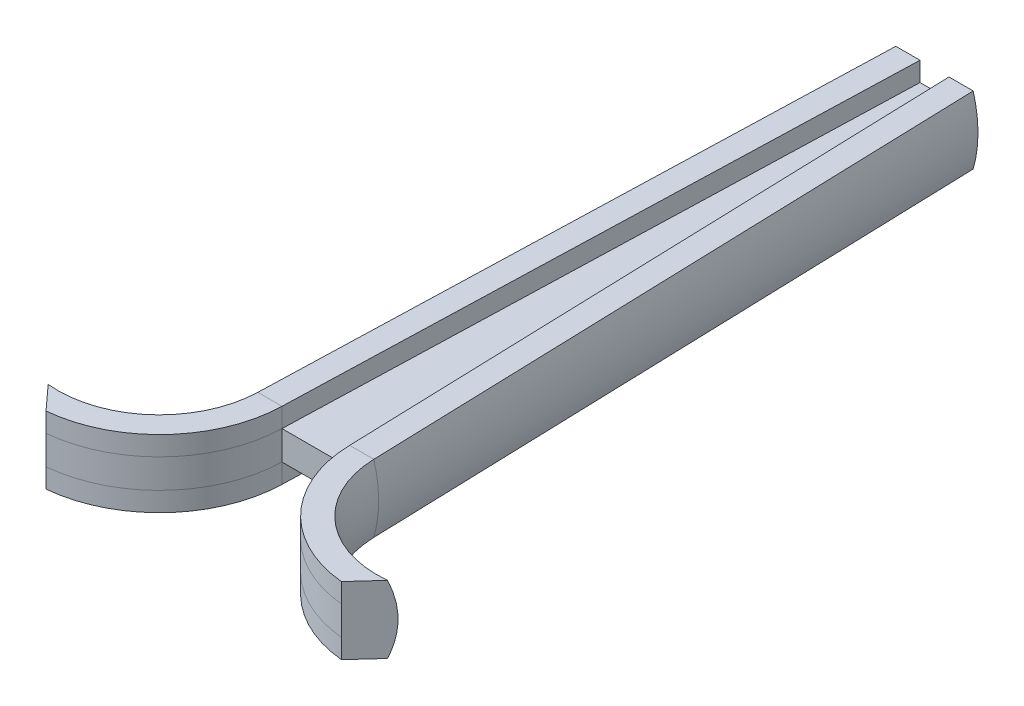
ISO-10303-21;
HEADER;
FILE_DESCRIPTION(('STEP AP214'),'2;1');
FILE_NAME('part.step','',(''),(''),'','','');
FILE_SCHEMA(('AUTOMOTIVE_DESIGN { 1 0 10303 214 1 1 1 1 }'));
ENDSEC;
DATA;
#1=APPLICATION_CONTEXT('core data for automotive mechanical design processes');
#2=APPLICATION_PROTOCOL_DEFINITION('international standard','automotive_design',2000,#1);
#3=PRODUCT_CONTEXT('',#1,'mechanical');
#4=PRODUCT('Part','Part','',(#3));
#5=PRODUCT_RELATED_PRODUCT_CATEGORY('part','',(#4));
#6=PRODUCT_DEFINITION_FORMATION('','',#4);
#7=PRODUCT_DEFINITION_CONTEXT('part definition',#1,'design');
#8=PRODUCT_DEFINITION('design','',#6,#7);
#9=PRODUCT_DEFINITION_SHAPE('','',#8);
#10=(LENGTH_UNIT() NAMED_UNIT(*) SI_UNIT(.MILLI.,.METRE.));
#11=(NAMED_UNIT(*) PLANE_ANGLE_UNIT() SI_UNIT($,.RADIAN.));
#12=(NAMED_UNIT(*) SI_UNIT($,.STERADIAN.) SOLID_ANGLE_UNIT());
#13=UNCERTAINTY_MEASURE_WITH_UNIT(LENGTH_MEASURE(1.E-05),#10,'distance_accuracy_value','');
#14=(GEOMETRIC_REPRESENTATION_CONTEXT(3) GLOBAL_UNCERTAINTY_ASSIGNED_CONTEXT((#13)) GLOBAL_UNIT_ASSIGNED_CONTEXT((#10,
#11,#12)) REPRESENTATION_CONTEXT('',''));
#15=CARTESIAN_POINT('',(0.,0.,0.));
#16=DIRECTION('',(0.,0.,1.));
#17=DIRECTION('',(1.,0.,0.));
#18=AXIS2_PLACEMENT_3D('',#15,#16,#17);
#19=CARTESIAN_POINT('',(3.17638631396321,0.,161.074653814652));
#20=DIRECTION('',(-0.739692933634489,0.,-0.672944547441469));
#21=DIRECTION('',(-0.672944547441469,0.,0.739692933634489));
#22=AXIS2_PLACEMENT_3D('',#19,#20,#21);
#23=CIRCLE('',#22,25.0000000000001);
#24=CARTESIAN_POINT('',(32.9902415217416,0.,127.375304952446));
#25=DIRECTION('',(0.,1.,0.));
#26=AXIS1_PLACEMENT('',#24,#25);
#27=SURFACE_OF_REVOLUTION('',#23,#26);
#28=CARTESIAN_POINT('',(32.9902415217416,-7.,127.375304952446));
#29=DIRECTION('',(0.,-1.,0.));
#30=DIRECTION('',(0.,0.,1.));
#31=AXIS2_PLACEMENT_3D('',#28,#29,#30);
#32=CIRCLE('',#31,20.9995353054177);
#33=CARTESIAN_POINT('',(35.1061024849226,-7.,148.267973892243));
#34=VERTEX_POINT('',#33);
#35=CARTESIAN_POINT('',(12.,-7.,128.));
#36=VERTEX_POINT('',#35);
#37=EDGE_CURVE('E14',#34,#36,#32,.T.);
#38=ORIENTED_EDGE('',*,*,#37,.T.);
#39=CARTESIAN_POINT('',(-12.0000000000001,0.,128.));
#40=DIRECTION('',(0.,0.,-1.));
#41=DIRECTION('',(-1.,0.,0.));
#42=AXIS2_PLACEMENT_3D('',#39,#40,#41);
#43=CIRCLE('',#42,25.0000000000001);
#44=CARTESIAN_POINT('',(12.,7.,128.));
#45=VERTEX_POINT('',#44);
#46=EDGE_CURVE('E159',#45,#36,#43,.T.);
#47=ORIENTED_EDGE('',*,*,#46,.F.);
#48=CARTESIAN_POINT('',(32.9902415217416,7.,127.375304952446));
#49=DIRECTION('',(0.,-1.,0.));
#50=DIRECTION('',(0.,0.,1.));
#51=AXIS2_PLACEMENT_3D('',#48,#49,#50);
#52=CIRCLE('',#51,20.9995353054177);
#53=CARTESIAN_POINT('',(35.1061024849226,7.,148.267973892243));
#54=VERTEX_POINT('',#53);
#55=EDGE_CURVE('E167',#54,#45,#52,.T.);
#56=ORIENTED_EDGE('',*,*,#55,.F.);
#57=CARTESIAN_POINT('',(35.0626526665789,7.14649101288148,148.315733434569));
#58=CARTESIAN_POINT('',(35.1981066814361,6.69434377829867,148.166843933936));
#59=CARTESIAN_POINT('',(35.3232717519765,6.23511321391761,148.02926392297));
#60=CARTESIAN_POINT('',(35.5503418994767,5.30305012162205,147.779671019388));
#61=CARTESIAN_POINT('',(35.6521962294173,4.83019039439527,147.667713907315));
#62=CARTESIAN_POINT('',(35.8292165024508,3.8741353353947,147.473135252103));
#63=CARTESIAN_POINT('',(35.904423367179,3.39095707009063,147.390468728373));
#64=CARTESIAN_POINT('',(35.9952897359116,2.66055889742659,147.290589457322));
#65=CARTESIAN_POINT('',(36.0219141692305,2.41626529683603,147.261324185372));
#66=CARTESIAN_POINT('',(36.0676175522336,1.92613418039715,147.211087550601));
#67=CARTESIAN_POINT('',(36.0866974301155,1.68029685825398,147.190115167516));
#68=CARTESIAN_POINT('',(36.1166137368573,1.19548603271227,147.15723150603));
#69=CARTESIAN_POINT('',(36.1276954346502,0.956545913933226,147.145050630828));
#70=CARTESIAN_POINT('',(36.142473537774,0.47840937396146,147.128806709253));
#71=CARTESIAN_POINT('',(36.1461773689263,0.23921345316919,147.124735500501));
#72=CARTESIAN_POINT('',(36.1461732054388,-0.35725853889842,147.124740076959));
#73=CARTESIAN_POINT('',(36.1379057478503,-0.714556183025839,147.133827571583));
#74=CARTESIAN_POINT('',(36.1050141210901,-1.42778197160046,147.169981670733));
#75=CARTESIAN_POINT('',(36.0803750017539,-1.78370856496889,147.197064708307));
#76=CARTESIAN_POINT('',(36.0152918835942,-2.49239700529461,147.268603325842));
#77=CARTESIAN_POINT('',(35.9748454907622,-2.84515836459559,147.313061537269));
#78=CARTESIAN_POINT('',(35.8785841954912,-3.54920150774648,147.418870849738));
#79=CARTESIAN_POINT('',(35.822638205367,-3.90044348830422,147.480366040861));
#80=CARTESIAN_POINT('',(35.6966064461704,-4.59719219762049,147.618898706065));
#81=CARTESIAN_POINT('',(35.6265229978706,-4.94269985764991,147.695933629179));
#82=CARTESIAN_POINT('',(35.4733538738764,-5.62723819108236,147.864295374734));
#83=CARTESIAN_POINT('',(35.3902687115773,-5.96626911963751,147.955621632858));
#84=CARTESIAN_POINT('',(35.1855580116418,-6.73782441950619,148.180637287948));
#85=CARTESIAN_POINT('',(35.0598407061075,-7.16795537785026,148.31882430929));
#86=CARTESIAN_POINT('',(34.7905809700665,-8.01586710350925,148.614791525042));
#87=CARTESIAN_POINT('',(34.6470304554189,-8.4336421626296,148.772580605447));
#88=CARTESIAN_POINT('',(34.3440113031595,-9.25659834892592,149.105655784575));
#89=CARTESIAN_POINT('',(34.1845311367843,-9.66177007248051,149.280954555582));
#90=CARTESIAN_POINT('',(33.8545672221664,-10.4513946783871,149.643647108669));
#91=CARTESIAN_POINT('',(33.6843510432102,-10.83609524011,149.830746781655));
#92=CARTESIAN_POINT('',(33.3317238667379,-11.5923985073428,150.218350532418));
#93=CARTESIAN_POINT('',(33.1493241309992,-11.9640128366648,150.418842231379));
#94=CARTESIAN_POINT('',(32.7736688132814,-12.6934345748804,150.831758251064));
#95=CARTESIAN_POINT('',(32.5804419946734,-13.0512746687439,151.04415095542));
#96=CARTESIAN_POINT('',(32.3820729735767,-13.4026338450831,151.262195909815));
#97=B_SPLINE_CURVE_WITH_KNOTS('',3,(#57,#58,#59,#60,#61,#62,#63,#64,#65,#66,#67,#68,#69,#70,#71,
#72,#73,#74,#75,#76,#77,#78,#79,#80,#81,#82,#83,#84,#85,#86,#87,#88,#89,#90,#91,#92,#93,#94,#95,
#96),.UNSPECIFIED.,.F.,.F.,(4,2,2,2,2,2,2,2,2,2,2,2,2,2,2,2,2,2,2,4),(0.,1.48485783746325,
2.97291806806036,4.45868312704454,5.20089962630527,5.94302478312199,6.66129448314192,
7.37884087882176,8.45047616319309,9.52309138367006,10.5958691145031,11.6780124241621,
12.7599782360183,13.8419013353509,15.2476978210801,16.6541339232256,18.0615953835683,
19.4422384981731,20.8216226289127,22.1975016311284),.UNSPECIFIED.);
#98=EDGE_CURVE('E166',#54,#34,#97,.T.);
#99=ORIENTED_EDGE('',*,*,#98,.T.);
#100=EDGE_LOOP('',(#38,#47,#56,#99));
#101=FACE_BOUND('',#100,.T.);
#102=ADVANCED_FACE('F91',(#101),#27,.T.);
#103=CARTESIAN_POINT('',(19.3270554525585,-7.,143.322023407425));
#104=DIRECTION('',(0.,1.,0.));
#105=DIRECTION('',(0.,0.,1.));
#106=AXIS2_PLACEMENT_3D('',#103,#104,#105);
#107=PLANE('',#106);
#108=CARTESIAN_POINT('',(32.9902415217416,-7.,127.375304952446));
#109=DIRECTION('',(0.,-1.,0.));
#110=DIRECTION('',(0.,0.,1.));
#111=AXIS2_PLACEMENT_3D('',#108,#109,#110);
#112=CIRCLE('',#111,25.9977479459452);
#113=CARTESIAN_POINT('',(30.5648467993829,-7.,153.259670092461));
#114=VERTEX_POINT('',#113);
#115=CARTESIAN_POINT('',(7.,-7.,128.));
#116=VERTEX_POINT('',#115);
#117=EDGE_CURVE('E102',#114,#116,#112,.T.);
#118=ORIENTED_EDGE('',*,*,#117,.T.);
#119=DIRECTION('',(-1.,0.,0.));
#120=VECTOR('',#119,1.);
#121=CARTESIAN_POINT('',(12.,-7.,128.));
#122=LINE('',#121,#120);
#123=EDGE_CURVE('E154',#36,#116,#122,.T.);
#124=ORIENTED_EDGE('',*,*,#123,.F.);
#125=ORIENTED_EDGE('',*,*,#37,.F.);
#126=DIRECTION('',(-0.672944547441469,0.,0.739692933634489));
#127=VECTOR('',#126,1.);
#128=CARTESIAN_POINT('',(30.4224494570758,-7.,153.416191619047));
#129=LINE('',#128,#127);
#130=EDGE_CURVE('E96',#34,#114,#129,.T.);
#131=ORIENTED_EDGE('',*,*,#130,.T.);
#132=EDGE_LOOP('',(#118,#124,#125,#131));
#133=FACE_BOUND('',#132,.T.);
#134=ADVANCED_FACE('F155',(#133),#107,.F.);
#135=CARTESIAN_POINT('',(32.9902415217416,0.,127.375304952446));
#136=DIRECTION('',(0.,1.,0.));
#137=DIRECTION('',(0.,0.,1.));
#138=AXIS2_PLACEMENT_3D('',#135,#136,#137);
#139=CYLINDRICAL_SURFACE('',#138,25.9977479459452);
#140=CARTESIAN_POINT('',(32.9902415217416,-3.,127.375304952446));
#141=DIRECTION('',(0.,-1.,0.));
#142=DIRECTION('',(0.,0.,1.));
#143=AXIS2_PLACEMENT_3D('',#140,#141,#142);
#144=CIRCLE('',#143,25.9977479459452);
#145=CARTESIAN_POINT('',(30.5648467993829,-3.,153.259670092461));
#146=VERTEX_POINT('',#145);
#147=CARTESIAN_POINT('',(6.99999999999999,-3.,128.));
#148=VERTEX_POINT('',#147);
#149=EDGE_CURVE('E195',#146,#148,#144,.T.);
#150=ORIENTED_EDGE('',*,*,#149,.T.);
#151=DIRECTION('',(0.,1.,0.));
#152=VECTOR('',#151,1.);
#153=CARTESIAN_POINT('',(7.,-7.,128.));
#154=LINE('',#153,#152);
#155=EDGE_CURVE('E158',#116,#148,#154,.T.);
#156=ORIENTED_EDGE('',*,*,#155,.F.);
#157=ORIENTED_EDGE('',*,*,#117,.F.);
#158=DIRECTION('',(0.,1.,0.));
#159=VECTOR('',#158,1.);
#160=CARTESIAN_POINT('',(30.5648467993829,0.,153.259670092461));
#161=LINE('',#160,#159);
#162=EDGE_CURVE('E128',#114,#146,#161,.T.);
#163=ORIENTED_EDGE('',*,*,#162,.T.);
#164=EDGE_LOOP('',(#150,#156,#157,#163));
#165=FACE_BOUND('',#164,.T.);
#166=ADVANCED_FACE('F199',(#165),#139,.T.);
#167=CARTESIAN_POINT('',(32.9902415217416,0.,127.375304952446));
#168=DIRECTION('',(0.,1.,0.));
#169=DIRECTION('',(0.,0.,1.));
#170=AXIS2_PLACEMENT_3D('',#167,#168,#169);
#171=CYLINDRICAL_SURFACE('',#170,25.9977479459452);
#172=CARTESIAN_POINT('',(32.9902415217416,3.,127.375304952446));
#173=DIRECTION('',(0.,-1.,0.));
#174=DIRECTION('',(0.,0.,1.));
#175=AXIS2_PLACEMENT_3D('',#172,#173,#174);
#176=CIRCLE('',#175,25.9977479459452);
#177=CARTESIAN_POINT('',(30.5648467993829,3.,153.259670092461));
#178=VERTEX_POINT('',#177);
#179=CARTESIAN_POINT('',(7.,3.,128.));
#180=VERTEX_POINT('',#179);
#181=EDGE_CURVE('E192',#178,#180,#176,.T.);
#182=ORIENTED_EDGE('',*,*,#181,.T.);
#183=DIRECTION('',(0.,1.,0.));
#184=VECTOR('',#183,1.);
#185=CARTESIAN_POINT('',(7.,3.,128.));
#186=LINE('',#185,#184);
#187=EDGE_CURVE('E206',#148,#180,#186,.T.);
#188=ORIENTED_EDGE('',*,*,#187,.F.);
#189=ORIENTED_EDGE('',*,*,#149,.F.);
#190=DIRECTION('',(0.,1.,0.));
#191=VECTOR('',#190,1.);
#192=CARTESIAN_POINT('',(30.5648467993829,0.,153.259670092461));
#193=LINE('',#192,#191);
#194=EDGE_CURVE('E203',#146,#178,#193,.T.);
#195=ORIENTED_EDGE('',*,*,#194,.T.);
#196=EDGE_LOOP('',(#182,#188,#189,#195));
#197=FACE_BOUND('',#196,.T.);
#198=ADVANCED_FACE('F202',(#197),#171,.T.);
#199=CARTESIAN_POINT('',(32.9902415217416,0.,127.375304952446));
#200=DIRECTION('',(0.,1.,0.));
#201=DIRECTION('',(0.,0.,1.));
#202=AXIS2_PLACEMENT_3D('',#199,#200,#201);
#203=CYLINDRICAL_SURFACE('',#202,25.9977479459452);
#204=CARTESIAN_POINT('',(32.9902415217416,7.,127.375304952446));
#205=DIRECTION('',(0.,-1.,0.));
#206=DIRECTION('',(0.,0.,1.));
#207=AXIS2_PLACEMENT_3D('',#204,#205,#206);
#208=CIRCLE('',#207,25.9977479459452);
#209=CARTESIAN_POINT('',(30.5648467993829,7.,153.259670092461));
#210=VERTEX_POINT('',#209);
#211=CARTESIAN_POINT('',(7.,7.,128.));
#212=VERTEX_POINT('',#211);
#213=EDGE_CURVE('E189',#210,#212,#208,.T.);
#214=ORIENTED_EDGE('',*,*,#213,.T.);
#215=DIRECTION('',(0.,1.,0.));
#216=VECTOR('',#215,1.);
#217=CARTESIAN_POINT('',(7.,3.,128.));
#218=LINE('',#217,#216);
#219=EDGE_CURVE('E169',#180,#212,#218,.T.);
#220=ORIENTED_EDGE('',*,*,#219,.F.);
#221=ORIENTED_EDGE('',*,*,#181,.F.);
#222=DIRECTION('',(0.,1.,0.));
#223=VECTOR('',#222,1.);
#224=CARTESIAN_POINT('',(30.5648467993829,0.,153.259670092461));
#225=LINE('',#224,#223);
#226=EDGE_CURVE('E212',#178,#210,#225,.T.);
#227=ORIENTED_EDGE('',*,*,#226,.T.);
#228=EDGE_LOOP('',(#214,#220,#221,#227));
#229=FACE_BOUND('',#228,.T.);
#230=ADVANCED_FACE('F211',(#229),#203,.T.);
#231=CARTESIAN_POINT('',(15.9623327153512,7.,147.020488075597));
#232=DIRECTION('',(0.,-1.,0.));
#233=DIRECTION('',(0.,0.,-1.));
#234=AXIS2_PLACEMENT_3D('',#231,#232,#233);
#235=PLANE('',#234);
#236=DIRECTION('',(0.672944547441469,0.,-0.739692933634489));
#237=VECTOR('',#236,1.);
#238=CARTESIAN_POINT('',(27.0577267198685,7.,157.114656287219));
#239=LINE('',#238,#237);
#240=EDGE_CURVE('E111',#210,#54,#239,.T.);
#241=ORIENTED_EDGE('',*,*,#240,.T.);
#242=ORIENTED_EDGE('',*,*,#55,.T.);
#243=DIRECTION('',(1.,0.,0.));
#244=VECTOR('',#243,1.);
#245=CARTESIAN_POINT('',(7.,7.,128.));
#246=LINE('',#245,#244);
#247=EDGE_CURVE('E137',#212,#45,#246,.T.);
#248=ORIENTED_EDGE('',*,*,#247,.F.);
#249=ORIENTED_EDGE('',*,*,#213,.F.);
#250=EDGE_LOOP('',(#241,#242,#248,#249));
#251=FACE_BOUND('',#250,.T.);
#252=ADVANCED_FACE('F183',(#251),#235,.F.);
#253=CARTESIAN_POINT('',(14.2717803184805,0.,171.168822026274));
#254=DIRECTION('',(0.739692933634489,0.,0.672944547441469));
#255=DIRECTION('',(-0.672944547441469,0.,0.739692933634489));
#256=AXIS2_PLACEMENT_3D('',#253,#254,#255);
#257=PLANE('',#256);
#258=ORIENTED_EDGE('',*,*,#98,.F.);
#259=ORIENTED_EDGE('',*,*,#240,.F.);
#260=ORIENTED_EDGE('',*,*,#226,.F.);
#261=ORIENTED_EDGE('',*,*,#194,.F.);
#262=ORIENTED_EDGE('',*,*,#162,.F.);
#263=ORIENTED_EDGE('',*,*,#130,.F.);
#264=EDGE_LOOP('',(#258,#259,#260,#261,#262,#263));
#265=FACE_BOUND('',#264,.T.);
#266=ADVANCED_FACE('F93',(#265),#257,.T.);
#267=CARTESIAN_POINT('',(-12.0000000000001,0.,128.));
#268=DIRECTION('',(0.,0.,1.));
#269=DIRECTION('',(-1.,0.,0.));
#270=AXIS2_PLACEMENT_3D('',#267,#268,#269);
#271=PLANE('',#270);
#272=ORIENTED_EDGE('',*,*,#46,.T.);
#273=ORIENTED_EDGE('',*,*,#123,.T.);
#274=ORIENTED_EDGE('',*,*,#155,.T.);
#275=ORIENTED_EDGE('',*,*,#187,.T.);
#276=ORIENTED_EDGE('',*,*,#219,.T.);
#277=ORIENTED_EDGE('',*,*,#247,.T.);
#278=EDGE_LOOP('',(#272,#273,#274,#275,#276,#277));
#279=FACE_BOUND('',#278,.T.);
#280=ADVANCED_FACE('F162',(#279),#271,.F.);
#281=CLOSED_SHELL('',(#102,#134,#166,#198,#230,#252,#266,#280));
#282=MANIFOLD_SOLID_BREP('B2',#281);
#283=CARTESIAN_POINT('',(-3.17638631396321,0.,161.074653814652));
#284=DIRECTION('',(-0.739692933634489,0.,0.672944547441469));
#285=DIRECTION('',(0.672944547441469,0.,0.739692933634489));
#286=AXIS2_PLACEMENT_3D('',#283,#284,#285);
#287=CIRCLE('',#286,25.0000000000001);
#288=CARTESIAN_POINT('',(-32.9902415217416,0.,127.375304952446));
#289=DIRECTION('',(0.,1.,0.));
#290=AXIS1_PLACEMENT('',#288,#289);
#291=SURFACE_OF_REVOLUTION('',#287,#290);
#292=CARTESIAN_POINT('',(-32.9902415217416,-7.,127.375304952446));
#293=DIRECTION('',(0.,1.,0.));
#294=DIRECTION('',(0.,0.,1.));
#295=AXIS2_PLACEMENT_3D('',#292,#293,#294);
#296=CIRCLE('',#295,20.9995353054177);
#297=CARTESIAN_POINT('',(-35.1061024849226,-7.,148.267973892243));
#298=VERTEX_POINT('',#297);
#299=CARTESIAN_POINT('',(-12.,-7.,128.));
#300=VERTEX_POINT('',#299);
#301=EDGE_CURVE('E89',#298,#300,#296,.T.);
#302=ORIENTED_EDGE('',*,*,#301,.F.);
#303=CARTESIAN_POINT('',(-35.0626526665789,7.14649101288148,148.315733434569));
#304=CARTESIAN_POINT('',(-35.1981066814361,6.69434377829867,148.166843933936));
#305=CARTESIAN_POINT('',(-35.3232717519765,6.23511321391761,148.02926392297));
#306=CARTESIAN_POINT('',(-35.5503418994767,5.30305012162205,147.779671019388));
#307=CARTESIAN_POINT('',(-35.6521962294173,4.83019039439527,147.667713907315));
#308=CARTESIAN_POINT('',(-35.8292165024508,3.8741353353947,147.473135252103));
#309=CARTESIAN_POINT('',(-35.904423367179,3.39095707009063,147.390468728373));
#310=CARTESIAN_POINT('',(-35.9952897359116,2.66055889742659,147.290589457322));
#311=CARTESIAN_POINT('',(-36.0219141692305,2.41626529683603,147.261324185372));
#312=CARTESIAN_POINT('',(-36.0676175522336,1.92613418039715,147.211087550601));
#313=CARTESIAN_POINT('',(-36.0866974301155,1.68029685825398,147.190115167516));
#314=CARTESIAN_POINT('',(-36.1166137368573,1.19548603271227,147.15723150603));
#315=CARTESIAN_POINT('',(-36.1276954346502,0.956545913933226,147.145050630828));
#316=CARTESIAN_POINT('',(-36.142473537774,0.47840937396146,147.128806709253));
#317=CARTESIAN_POINT('',(-36.1461773689263,0.23921345316919,147.124735500501));
#318=CARTESIAN_POINT('',(-36.1461732054388,-0.35725853889842,147.124740076959));
#319=CARTESIAN_POINT('',(-36.1379057478503,-0.714556183025839,147.133827571583));
#320=CARTESIAN_POINT('',(-36.1050141210901,-1.42778197160046,147.169981670733));
#321=CARTESIAN_POINT('',(-36.0803750017539,-1.78370856496889,147.197064708307));
#322=CARTESIAN_POINT('',(-36.0152918835942,-2.49239700529461,147.268603325842));
#323=CARTESIAN_POINT('',(-35.9748454907622,-2.84515836459559,147.313061537269));
#324=CARTESIAN_POINT('',(-35.8785841954912,-3.54920150774648,147.418870849738));
#325=CARTESIAN_POINT('',(-35.822638205367,-3.90044348830422,147.480366040861));
#326=CARTESIAN_POINT('',(-35.6966064461704,-4.59719219762049,147.618898706065));
#327=CARTESIAN_POINT('',(-35.6265229978706,-4.94269985764991,147.695933629179));
#328=CARTESIAN_POINT('',(-35.4733538738764,-5.62723819108236,147.864295374734));
#329=CARTESIAN_POINT('',(-35.3902687115773,-5.96626911963751,147.955621632858));
#330=CARTESIAN_POINT('',(-35.1855580116418,-6.73782441950619,148.180637287948));
#331=CARTESIAN_POINT('',(-35.0598407061075,-7.16795537785026,148.31882430929));
#332=CARTESIAN_POINT('',(-34.7905809700665,-8.01586710350925,148.614791525042));
#333=CARTESIAN_POINT('',(-34.6470304554189,-8.4336421626296,148.772580605447));
#334=CARTESIAN_POINT('',(-34.3440113031595,-9.25659834892592,149.105655784575));
#335=CARTESIAN_POINT('',(-34.1845311367843,-9.66177007248051,149.280954555582));
#336=CARTESIAN_POINT('',(-33.8545672221664,-10.4513946783871,149.643647108669));
#337=CARTESIAN_POINT('',(-33.6843510432102,-10.83609524011,149.830746781655));
#338=CARTESIAN_POINT('',(-33.3317238667379,-11.5923985073428,150.218350532418));
#339=CARTESIAN_POINT('',(-33.1493241309992,-11.9640128366648,150.418842231379));
#340=CARTESIAN_POINT('',(-32.7736688132814,-12.6934345748804,150.831758251064));
#341=CARTESIAN_POINT('',(-32.5804419946734,-13.0512746687439,151.04415095542));
#342=CARTESIAN_POINT('',(-32.3820729735767,-13.4026338450831,151.262195909815));
#343=B_SPLINE_CURVE_WITH_KNOTS('',3,(#303,#304,#305,#306,#307,#308,#309,#310,#311,#312,#313,
#314,#315,#316,#317,#318,#319,#320,#321,#322,#323,#324,#325,#326,#327,#328,#329,#330,#331,#332,
#333,#334,#335,#336,#337,#338,#339,#340,#341,#342),.UNSPECIFIED.,.F.,.F.,(4,2,2,2,2,2,2,2,2,2,2,
2,2,2,2,2,2,2,2,4),(0.,1.48485783746325,2.97291806806036,4.45868312704454,5.20089962630527,
5.94302478312199,6.66129448314192,7.37884087882176,8.45047616319309,9.52309138367006,
10.5958691145031,11.6780124241621,12.7599782360183,13.8419013353509,15.2476978210801,
16.6541339232256,18.0615953835683,19.4422384981731,20.8216226289127,22.1975016311284),.UNSPECIFIED.);
#344=CARTESIAN_POINT('',(-35.1061024849226,7.,148.267973892243));
#345=VERTEX_POINT('',#344);
#346=EDGE_CURVE('E364',#345,#298,#343,.T.);
#347=ORIENTED_EDGE('',*,*,#346,.F.);
#348=CARTESIAN_POINT('',(-32.9902415217416,7.,127.375304952446));
#349=DIRECTION('',(0.,1.,0.));
#350=DIRECTION('',(0.,0.,1.));
#351=AXIS2_PLACEMENT_3D('',#348,#349,#350);
#352=CIRCLE('',#351,20.9995353054177);
#353=CARTESIAN_POINT('',(-12.,7.,128.));
#354=VERTEX_POINT('',#353);
#355=EDGE_CURVE('E303',#345,#354,#352,.T.);
#356=ORIENTED_EDGE('',*,*,#355,.T.);
#357=CARTESIAN_POINT('',(12.0000000000001,0.,128.));
#358=DIRECTION('',(0.,0.,1.));
#359=DIRECTION('',(1.,0.,0.));
#360=AXIS2_PLACEMENT_3D('',#357,#358,#359);
#361=CIRCLE('',#360,25.0000000000001);
#362=EDGE_CURVE('E346',#354,#300,#361,.T.);
#363=ORIENTED_EDGE('',*,*,#362,.T.);
#364=EDGE_LOOP('',(#302,#347,#356,#363));
#365=FACE_BOUND('',#364,.T.);
#366=ADVANCED_FACE('F283',(#365),#291,.T.);
#367=CARTESIAN_POINT('',(-19.3270554525585,-7.,143.322023407425));
#368=DIRECTION('',(0.,1.,0.));
#369=DIRECTION('',(0.,0.,1.));
#370=AXIS2_PLACEMENT_3D('',#367,#368,#369);
#371=PLANE('',#370);
#372=CARTESIAN_POINT('',(-32.9902415217416,-7.,127.375304952446));
#373=DIRECTION('',(0.,1.,0.));
#374=DIRECTION('',(0.,0.,1.));
#375=AXIS2_PLACEMENT_3D('',#372,#373,#374);
#376=CIRCLE('',#375,25.9977479459452);
#377=CARTESIAN_POINT('',(-30.5648467993829,-7.,153.259670092461));
#378=VERTEX_POINT('',#377);
#379=CARTESIAN_POINT('',(-7.,-7.,128.));
#380=VERTEX_POINT('',#379);
#381=EDGE_CURVE('E294',#378,#380,#376,.T.);
#382=ORIENTED_EDGE('',*,*,#381,.F.);
#383=DIRECTION('',(0.672944547441469,0.,0.739692933634489));
#384=VECTOR('',#383,1.);
#385=CARTESIAN_POINT('',(-30.4224494570758,-7.,153.416191619047));
#386=LINE('',#385,#384);
#387=EDGE_CURVE('E288',#298,#378,#386,.T.);
#388=ORIENTED_EDGE('',*,*,#387,.F.);
#389=ORIENTED_EDGE('',*,*,#301,.T.);
#390=DIRECTION('',(1.,0.,0.));
#391=VECTOR('',#390,1.);
#392=CARTESIAN_POINT('',(-12.,-7.,128.));
#393=LINE('',#392,#391);
#394=EDGE_CURVE('E344',#300,#380,#393,.T.);
#395=ORIENTED_EDGE('',*,*,#394,.T.);
#396=EDGE_LOOP('',(#382,#388,#389,#395));
#397=FACE_BOUND('',#396,.T.);
#398=ADVANCED_FACE('F342',(#397),#371,.F.);
#399=CARTESIAN_POINT('',(-32.9902415217416,0.,127.375304952446));
#400=DIRECTION('',(0.,1.,0.));
#401=DIRECTION('',(0.,0.,1.));
#402=AXIS2_PLACEMENT_3D('',#399,#400,#401);
#403=CYLINDRICAL_SURFACE('',#402,25.9977479459452);
#404=CARTESIAN_POINT('',(-32.9902415217416,-3.,127.375304952446));
#405=DIRECTION('',(0.,1.,0.));
#406=DIRECTION('',(0.,0.,1.));
#407=AXIS2_PLACEMENT_3D('',#404,#405,#406);
#408=CIRCLE('',#407,25.9977479459452);
#409=CARTESIAN_POINT('',(-30.5648467993829,-3.,153.259670092461));
#410=VERTEX_POINT('',#409);
#411=CARTESIAN_POINT('',(-6.99999999999999,-3.,128.));
#412=VERTEX_POINT('',#411);
#413=EDGE_CURVE('E396',#410,#412,#408,.T.);
#414=ORIENTED_EDGE('',*,*,#413,.F.);
#415=DIRECTION('',(0.,1.,0.));
#416=VECTOR('',#415,1.);
#417=CARTESIAN_POINT('',(-30.5648467993829,0.,153.259670092461));
#418=LINE('',#417,#416);
#419=EDGE_CURVE('E389',#378,#410,#418,.T.);
#420=ORIENTED_EDGE('',*,*,#419,.F.);
#421=ORIENTED_EDGE('',*,*,#381,.T.);
#422=DIRECTION('',(0.,1.,0.));
#423=VECTOR('',#422,1.);
#424=CARTESIAN_POINT('',(-7.,-7.,128.));
#425=LINE('',#424,#423);
#426=EDGE_CURVE('E353',#380,#412,#425,.T.);
#427=ORIENTED_EDGE('',*,*,#426,.T.);
#428=EDGE_LOOP('',(#414,#420,#421,#427));
#429=FACE_BOUND('',#428,.T.);
#430=ADVANCED_FACE('F395',(#429),#403,.T.);
#431=CARTESIAN_POINT('',(-32.9902415217416,0.,127.375304952446));
#432=DIRECTION('',(0.,1.,0.));
#433=DIRECTION('',(0.,0.,1.));
#434=AXIS2_PLACEMENT_3D('',#431,#432,#433);
#435=CYLINDRICAL_SURFACE('',#434,25.9977479459452);
#436=CARTESIAN_POINT('',(-32.9902415217416,3.,127.375304952446));
#437=DIRECTION('',(0.,1.,0.));
#438=DIRECTION('',(0.,0.,1.));
#439=AXIS2_PLACEMENT_3D('',#436,#437,#438);
#440=CIRCLE('',#439,25.9977479459452);
#441=CARTESIAN_POINT('',(-30.5648467993829,3.,153.259670092461));
#442=VERTEX_POINT('',#441);
#443=CARTESIAN_POINT('',(-7.,3.,128.));
#444=VERTEX_POINT('',#443);
#445=EDGE_CURVE('E398',#442,#444,#440,.T.);
#446=ORIENTED_EDGE('',*,*,#445,.F.);
#447=DIRECTION('',(0.,1.,0.));
#448=VECTOR('',#447,1.);
#449=CARTESIAN_POINT('',(-30.5648467993829,0.,153.259670092461));
#450=LINE('',#449,#448);
#451=EDGE_CURVE('E387',#410,#442,#450,.T.);
#452=ORIENTED_EDGE('',*,*,#451,.F.);
#453=ORIENTED_EDGE('',*,*,#413,.T.);
#454=DIRECTION('',(0.,1.,0.));
#455=VECTOR('',#454,1.);
#456=CARTESIAN_POINT('',(-7.,3.,128.));
#457=LINE('',#456,#455);
#458=EDGE_CURVE('E355',#412,#444,#457,.T.);
#459=ORIENTED_EDGE('',*,*,#458,.T.);
#460=EDGE_LOOP('',(#446,#452,#453,#459));
#461=FACE_BOUND('',#460,.T.);
#462=ADVANCED_FACE('F405',(#461),#435,.T.);
#463=CARTESIAN_POINT('',(-32.9902415217416,0.,127.375304952446));
#464=DIRECTION('',(0.,1.,0.));
#465=DIRECTION('',(0.,0.,1.));
#466=AXIS2_PLACEMENT_3D('',#463,#464,#465);
#467=CYLINDRICAL_SURFACE('',#466,25.9977479459452);
#468=CARTESIAN_POINT('',(-32.9902415217416,7.,127.375304952446));
#469=DIRECTION('',(0.,1.,0.));
#470=DIRECTION('',(0.,0.,1.));
#471=AXIS2_PLACEMENT_3D('',#468,#469,#470);
#472=CIRCLE('',#471,25.9977479459452);
#473=CARTESIAN_POINT('',(-30.5648467993829,7.,153.259670092461));
#474=VERTEX_POINT('',#473);
#475=CARTESIAN_POINT('',(-7.,7.,128.));
#476=VERTEX_POINT('',#475);
#477=EDGE_CURVE('E331',#474,#476,#472,.T.);
#478=ORIENTED_EDGE('',*,*,#477,.F.);
#479=DIRECTION('',(0.,1.,0.));
#480=VECTOR('',#479,1.);
#481=CARTESIAN_POINT('',(-30.5648467993829,0.,153.259670092461));
#482=LINE('',#481,#480);
#483=EDGE_CURVE('E384',#442,#474,#482,.T.);
#484=ORIENTED_EDGE('',*,*,#483,.F.);
#485=ORIENTED_EDGE('',*,*,#445,.T.);
#486=DIRECTION('',(0.,1.,0.));
#487=VECTOR('',#486,1.);
#488=CARTESIAN_POINT('',(-7.,3.,128.));
#489=LINE('',#488,#487);
#490=EDGE_CURVE('E360',#444,#476,#489,.T.);
#491=ORIENTED_EDGE('',*,*,#490,.T.);
#492=EDGE_LOOP('',(#478,#484,#485,#491));
#493=FACE_BOUND('',#492,.T.);
#494=ADVANCED_FACE('F403',(#493),#467,.T.);
#495=CARTESIAN_POINT('',(-15.9623327153512,7.,147.020488075597));
#496=DIRECTION('',(0.,-1.,0.));
#497=DIRECTION('',(0.,0.,-1.));
#498=AXIS2_PLACEMENT_3D('',#495,#496,#497);
#499=PLANE('',#498);
#500=DIRECTION('',(-0.672944547441469,0.,-0.739692933634489));
#501=VECTOR('',#500,1.);
#502=CARTESIAN_POINT('',(-27.0577267198685,7.,157.114656287219));
#503=LINE('',#502,#501);
#504=EDGE_CURVE('E381',#474,#345,#503,.T.);
#505=ORIENTED_EDGE('',*,*,#504,.F.);
#506=ORIENTED_EDGE('',*,*,#477,.T.);
#507=DIRECTION('',(-1.,0.,0.));
#508=VECTOR('',#507,1.);
#509=CARTESIAN_POINT('',(-7.,7.,128.));
#510=LINE('',#509,#508);
#511=EDGE_CURVE('E362',#476,#354,#510,.T.);
#512=ORIENTED_EDGE('',*,*,#511,.T.);
#513=ORIENTED_EDGE('',*,*,#355,.F.);
#514=EDGE_LOOP('',(#505,#506,#512,#513));
#515=FACE_BOUND('',#514,.T.);
#516=ADVANCED_FACE('F373',(#515),#499,.F.);
#517=CARTESIAN_POINT('',(-14.2717803184805,0.,171.168822026274));
#518=DIRECTION('',(-0.739692933634489,0.,0.672944547441469));
#519=DIRECTION('',(0.672944547441469,0.,0.739692933634489));
#520=AXIS2_PLACEMENT_3D('',#517,#518,#519);
#521=PLANE('',#520);
#522=ORIENTED_EDGE('',*,*,#346,.T.);
#523=ORIENTED_EDGE('',*,*,#387,.T.);
#524=ORIENTED_EDGE('',*,*,#419,.T.);
#525=ORIENTED_EDGE('',*,*,#451,.T.);
#526=ORIENTED_EDGE('',*,*,#483,.T.);
#527=ORIENTED_EDGE('',*,*,#504,.T.);
#528=EDGE_LOOP('',(#522,#523,#524,#525,#526,#527));
#529=FACE_BOUND('',#528,.T.);
#530=ADVANCED_FACE('F285',(#529),#521,.T.);
#531=CARTESIAN_POINT('',(12.0000000000001,0.,128.));
#532=DIRECTION('',(0.,0.,1.));
#533=DIRECTION('',(1.,0.,0.));
#534=AXIS2_PLACEMENT_3D('',#531,#532,#533);
#535=PLANE('',#534);
#536=ORIENTED_EDGE('',*,*,#362,.F.);
#537=ORIENTED_EDGE('',*,*,#511,.F.);
#538=ORIENTED_EDGE('',*,*,#490,.F.);
#539=ORIENTED_EDGE('',*,*,#458,.F.);
#540=ORIENTED_EDGE('',*,*,#426,.F.);
#541=ORIENTED_EDGE('',*,*,#394,.F.);
#542=EDGE_LOOP('',(#536,#537,#538,#539,#540,#541));
#543=FACE_BOUND('',#542,.T.);
#544=ADVANCED_FACE('F350',(#543),#535,.F.);
#545=CLOSED_SHELL('',(#366,#398,#430,#462,#494,#516,#530,#544));
#546=MANIFOLD_SOLID_BREP('B8',#545);
#547=CARTESIAN_POINT('',(16.0000000000001,0.,0.));
#548=DIRECTION('',(0.,0.,1.));
#549=DIRECTION('',(1.,0.,0.));
#550=AXIS2_PLACEMENT_3D('',#547,#548,#549);
#551=PLANE('',#550);
#552=DIRECTION('',(0.,1.,0.));
#553=VECTOR('',#552,1.);
#554=CARTESIAN_POINT('',(-3.,3.,0.));
#555=LINE('',#554,#553);
#556=CARTESIAN_POINT('',(-3.,3.,0.));
#557=VERTEX_POINT('',#556);
#558=CARTESIAN_POINT('',(-3.,7.,0.));
#559=VERTEX_POINT('',#558);
#560=EDGE_CURVE('E561',#557,#559,#555,.T.);
#561=ORIENTED_EDGE('',*,*,#560,.F.);
#562=DIRECTION('',(-1.,0.,0.));
#563=VECTOR('',#562,1.);
#564=CARTESIAN_POINT('',(3.,3.,0.));
#565=LINE('',#564,#563);
#566=CARTESIAN_POINT('',(3.,3.,0.));
#567=VERTEX_POINT('',#566);
#568=EDGE_CURVE('E589',#567,#557,#565,.T.);
#569=ORIENTED_EDGE('',*,*,#568,.F.);
#570=DIRECTION('',(0.,-1.,0.));
#571=VECTOR('',#570,1.);
#572=CARTESIAN_POINT('',(3.,3.,0.));
#573=LINE('',#572,#571);
#574=CARTESIAN_POINT('',(3.,7.,0.));
#575=VERTEX_POINT('',#574);
#576=EDGE_CURVE('E1118',#575,#567,#573,.T.);
#577=ORIENTED_EDGE('',*,*,#576,.F.);
#578=DIRECTION('',(-1.,0.,0.));
#579=VECTOR('',#578,1.);
#580=CARTESIAN_POINT('',(3.,7.,0.));
#581=LINE('',#580,#579);
#582=CARTESIAN_POINT('',(8.,7.,0.));
#583=VERTEX_POINT('',#582);
#584=EDGE_CURVE('E1109',#583,#575,#581,.T.);
#585=ORIENTED_EDGE('',*,*,#584,.F.);
#586=CARTESIAN_POINT('',(-16.0000000000001,0.,0.));
#587=DIRECTION('',(0.,0.,1.));
#588=DIRECTION('',(-1.,0.,0.));
#589=AXIS2_PLACEMENT_3D('',#586,#587,#588);
#590=CIRCLE('',#589,25.0000000000001);
#591=CARTESIAN_POINT('',(8.,-6.99999999999999,0.));
#592=VERTEX_POINT('',#591);
#593=EDGE_CURVE('E1101',#592,#583,#590,.T.);
#594=ORIENTED_EDGE('',*,*,#593,.F.);
#595=DIRECTION('',(1.,0.,0.));
#596=VECTOR('',#595,1.);
#597=CARTESIAN_POINT('',(3.,-7.,0.));
#598=LINE('',#597,#596);
#599=CARTESIAN_POINT('',(3.,-7.,0.));
#600=VERTEX_POINT('',#599);
#601=EDGE_CURVE('E1008',#600,#592,#598,.T.);
#602=ORIENTED_EDGE('',*,*,#601,.F.);
#603=DIRECTION('',(0.,-1.,0.));
#604=VECTOR('',#603,1.);
#605=CARTESIAN_POINT('',(3.,-3.,0.));
#606=LINE('',#605,#604);
#607=CARTESIAN_POINT('',(3.,-3.,0.));
#608=VERTEX_POINT('',#607);
#609=EDGE_CURVE('E995',#608,#600,#606,.T.);
#610=ORIENTED_EDGE('',*,*,#609,.F.);
#611=DIRECTION('',(1.,0.,0.));
#612=VECTOR('',#611,1.);
#613=CARTESIAN_POINT('',(3.,-3.,0.));
#614=LINE('',#613,#612);
#615=CARTESIAN_POINT('',(-3.,-3.,0.));
#616=VERTEX_POINT('',#615);
#617=EDGE_CURVE('E942',#616,#608,#614,.T.);
#618=ORIENTED_EDGE('',*,*,#617,.F.);
#619=DIRECTION('',(0.,1.,0.));
#620=VECTOR('',#619,1.);
#621=CARTESIAN_POINT('',(-3.,-3.,0.));
#622=LINE('',#621,#620);
#623=CARTESIAN_POINT('',(-3.,-7.,0.));
#624=VERTEX_POINT('',#623);
#625=EDGE_CURVE('E1070',#624,#616,#622,.T.);
#626=ORIENTED_EDGE('',*,*,#625,.F.);
#627=DIRECTION('',(1.,0.,0.));
#628=VECTOR('',#627,1.);
#629=CARTESIAN_POINT('',(-3.,-7.,0.));
#630=LINE('',#629,#628);
#631=CARTESIAN_POINT('',(-8.,-7.,0.));
#632=VERTEX_POINT('',#631);
#633=EDGE_CURVE('E784',#632,#624,#630,.T.);
#634=ORIENTED_EDGE('',*,*,#633,.F.);
#635=CARTESIAN_POINT('',(16.0000000000001,0.,0.));
#636=DIRECTION('',(0.,0.,1.));
#637=DIRECTION('',(1.,0.,0.));
#638=AXIS2_PLACEMENT_3D('',#635,#636,#637);
#639=CIRCLE('',#638,25.0000000000001);
#640=CARTESIAN_POINT('',(-8.,7.,0.));
#641=VERTEX_POINT('',#640);
#642=EDGE_CURVE('E554',#641,#632,#639,.T.);
#643=ORIENTED_EDGE('',*,*,#642,.F.);
#644=DIRECTION('',(-1.,0.,0.));
#645=VECTOR('',#644,1.);
#646=CARTESIAN_POINT('',(-3.,7.,0.));
#647=LINE('',#646,#645);
#648=EDGE_CURVE('E558',#559,#641,#647,.T.);
#649=ORIENTED_EDGE('',*,*,#648,.F.);
#650=EDGE_LOOP('',(#561,#569,#577,#585,#594,#602,#610,#618,#626,#634,#643,#649));
#651=FACE_BOUND('',#650,.T.);
#652=ADVANCED_FACE('F466',(#651),#551,.F.);
#653=CARTESIAN_POINT('',(12.0000000000001,0.,128.));
#654=DIRECTION('',(0.,0.,1.));
#655=DIRECTION('',(1.,0.,0.));
#656=AXIS2_PLACEMENT_3D('',#653,#654,#655);
#657=PLANE('',#656);
#658=DIRECTION('',(0.,1.,0.));
#659=VECTOR('',#658,1.);
#660=CARTESIAN_POINT('',(-7.,3.,128.));
#661=LINE('',#660,#659);
#662=CARTESIAN_POINT('',(-7.,3.,128.));
#663=VERTEX_POINT('',#662);
#664=CARTESIAN_POINT('',(-7.,7.,128.));
#665=VERTEX_POINT('',#664);
#666=EDGE_CURVE('E599',#663,#665,#661,.T.);
#667=ORIENTED_EDGE('',*,*,#666,.T.);
#668=DIRECTION('',(-1.,0.,0.));
#669=VECTOR('',#668,1.);
#670=CARTESIAN_POINT('',(-7.,7.,128.));
#671=LINE('',#670,#669);
#672=CARTESIAN_POINT('',(-12.,7.,128.));
#673=VERTEX_POINT('',#672);
#674=EDGE_CURVE('E583',#665,#673,#671,.T.);
#675=ORIENTED_EDGE('',*,*,#674,.T.);
#676=CARTESIAN_POINT('',(12.0000000000001,0.,128.));
#677=DIRECTION('',(0.,0.,1.));
#678=DIRECTION('',(1.,0.,0.));
#679=AXIS2_PLACEMENT_3D('',#676,#677,#678);
#680=CIRCLE('',#679,25.0000000000001);
#681=CARTESIAN_POINT('',(-12.,-7.,128.));
#682=VERTEX_POINT('',#681);
#683=EDGE_CURVE('E715',#673,#682,#680,.T.);
#684=ORIENTED_EDGE('',*,*,#683,.T.);
#685=DIRECTION('',(1.,0.,0.));
#686=VECTOR('',#685,1.);
#687=CARTESIAN_POINT('',(-7.,-7.,128.));
#688=LINE('',#687,#686);
#689=CARTESIAN_POINT('',(-7.,-7.,128.));
#690=VERTEX_POINT('',#689);
#691=EDGE_CURVE('E719',#682,#690,#688,.T.);
#692=ORIENTED_EDGE('',*,*,#691,.T.);
#693=DIRECTION('',(0.,1.,0.));
#694=VECTOR('',#693,1.);
#695=CARTESIAN_POINT('',(-7.,-3.,128.));
#696=LINE('',#695,#694);
#697=CARTESIAN_POINT('',(-6.99999999999999,-3.,128.));
#698=VERTEX_POINT('',#697);
#699=EDGE_CURVE('E1067',#690,#698,#696,.T.);
#700=ORIENTED_EDGE('',*,*,#699,.T.);
#701=DIRECTION('',(1.,0.,0.));
#702=VECTOR('',#701,1.);
#703=CARTESIAN_POINT('',(7.,-3.,128.));
#704=LINE('',#703,#702);
#705=CARTESIAN_POINT('',(7.,-3.,128.));
#706=VERTEX_POINT('',#705);
#707=EDGE_CURVE('E946',#698,#706,#704,.T.);
#708=ORIENTED_EDGE('',*,*,#707,.T.);
#709=DIRECTION('',(0.,-1.,0.));
#710=VECTOR('',#709,1.);
#711=CARTESIAN_POINT('',(7.,-3.,128.));
#712=LINE('',#711,#710);
#713=CARTESIAN_POINT('',(7.,-7.,128.));
#714=VERTEX_POINT('',#713);
#715=EDGE_CURVE('E1059',#706,#714,#712,.T.);
#716=ORIENTED_EDGE('',*,*,#715,.T.);
#717=DIRECTION('',(1.,0.,0.));
#718=VECTOR('',#717,1.);
#719=CARTESIAN_POINT('',(7.,-7.,128.));
#720=LINE('',#719,#718);
#721=CARTESIAN_POINT('',(12.,-7.,128.));
#722=VERTEX_POINT('',#721);
#723=EDGE_CURVE('E1048',#714,#722,#720,.T.);
#724=ORIENTED_EDGE('',*,*,#723,.T.);
#725=CARTESIAN_POINT('',(-12.0000000000001,0.,128.));
#726=DIRECTION('',(0.,0.,1.));
#727=DIRECTION('',(-1.,0.,0.));
#728=AXIS2_PLACEMENT_3D('',#725,#726,#727);
#729=CIRCLE('',#728,25.0000000000001);
#730=CARTESIAN_POINT('',(12.,7.,128.));
#731=VERTEX_POINT('',#730);
#732=EDGE_CURVE('E1182',#722,#731,#729,.T.);
#733=ORIENTED_EDGE('',*,*,#732,.T.);
#734=DIRECTION('',(-1.,0.,0.));
#735=VECTOR('',#734,1.);
#736=CARTESIAN_POINT('',(7.,7.,128.));
#737=LINE('',#736,#735);
#738=CARTESIAN_POINT('',(7.,7.,128.));
#739=VERTEX_POINT('',#738);
#740=EDGE_CURVE('E1170',#731,#739,#737,.T.);
#741=ORIENTED_EDGE('',*,*,#740,.T.);
#742=DIRECTION('',(0.,-1.,0.));
#743=VECTOR('',#742,1.);
#744=CARTESIAN_POINT('',(7.,3.,128.));
#745=LINE('',#744,#743);
#746=CARTESIAN_POINT('',(7.,3.,128.));
#747=VERTEX_POINT('',#746);
#748=EDGE_CURVE('E477',#739,#747,#745,.T.);
#749=ORIENTED_EDGE('',*,*,#748,.T.);
#750=DIRECTION('',(-1.,0.,0.));
#751=VECTOR('',#750,1.);
#752=CARTESIAN_POINT('',(7.,3.,128.));
#753=LINE('',#752,#751);
#754=EDGE_CURVE('E281',#747,#663,#753,.T.);
#755=ORIENTED_EDGE('',*,*,#754,.T.);
#756=EDGE_LOOP('',(#667,#675,#684,#692,#700,#708,#716,#724,#733,#741,#749,#755));
#757=FACE_BOUND('',#756,.T.);
#758=ADVANCED_FACE('F636',(#757),#657,.T.);
#759=CARTESIAN_POINT('',(2.99707317073171,0.,-0.0936585365853659));
#760=DIRECTION('',(-0.999512076087079,0.,0.0312347523777212));
#761=DIRECTION('',(0.0312347523777212,0.,0.999512076087079));
#762=AXIS2_PLACEMENT_3D('',#759,#760,#761);
#763=PLANE('',#762);
#764=DIRECTION('',(-0.0312347523777212,0.,-0.999512076087079));
#765=VECTOR('',#764,1.);
#766=CARTESIAN_POINT('',(7.,7.,128.));
#767=LINE('',#766,#765);
#768=EDGE_CURVE('E1144',#739,#575,#767,.T.);
#769=ORIENTED_EDGE('',*,*,#768,.T.);
#770=ORIENTED_EDGE('',*,*,#576,.T.);
#771=DIRECTION('',(-0.0312347523777212,0.,-0.999512076087079));
#772=VECTOR('',#771,1.);
#773=CARTESIAN_POINT('',(7.,3.,128.));
#774=LINE('',#773,#772);
#775=EDGE_CURVE('E1142',#747,#567,#774,.T.);
#776=ORIENTED_EDGE('',*,*,#775,.F.);
#777=ORIENTED_EDGE('',*,*,#748,.F.);
#778=EDGE_LOOP('',(#769,#770,#776,#777));
#779=FACE_BOUND('',#778,.T.);
#780=ADVANCED_FACE('F645',(#779),#763,.T.);
#781=CARTESIAN_POINT('',(0.,3.,0.));
#782=DIRECTION('',(0.,1.,0.));
#783=DIRECTION('',(-1.,0.,0.));
#784=AXIS2_PLACEMENT_3D('',#781,#782,#783);
#785=PLANE('',#784);
#786=ORIENTED_EDGE('',*,*,#775,.T.);
#787=ORIENTED_EDGE('',*,*,#568,.T.);
#788=DIRECTION('',(0.0312347523777212,0.,-0.999512076087079));
#789=VECTOR('',#788,1.);
#790=CARTESIAN_POINT('',(-7.,3.,128.));
#791=LINE('',#790,#789);
#792=EDGE_CURVE('E576',#663,#557,#791,.T.);
#793=ORIENTED_EDGE('',*,*,#792,.F.);
#794=ORIENTED_EDGE('',*,*,#754,.F.);
#795=EDGE_LOOP('',(#786,#787,#793,#794));
#796=FACE_BOUND('',#795,.T.);
#797=ADVANCED_FACE('F845',(#796),#785,.T.);
#798=CARTESIAN_POINT('',(0.,7.,0.));
#799=DIRECTION('',(0.,1.,0.));
#800=DIRECTION('',(-1.,0.,0.));
#801=AXIS2_PLACEMENT_3D('',#798,#799,#800);
#802=PLANE('',#801);
#803=DIRECTION('',(-0.0312347523777212,0.,-0.999512076087079));
#804=VECTOR('',#803,1.);
#805=CARTESIAN_POINT('',(12.,7.,128.));
#806=LINE('',#805,#804);
#807=EDGE_CURVE('E1043',#731,#583,#806,.T.);
#808=ORIENTED_EDGE('',*,*,#807,.T.);
#809=ORIENTED_EDGE('',*,*,#584,.T.);
#810=ORIENTED_EDGE('',*,*,#768,.F.);
#811=ORIENTED_EDGE('',*,*,#740,.F.);
#812=EDGE_LOOP('',(#808,#809,#810,#811));
#813=FACE_BOUND('',#812,.T.);
#814=ADVANCED_FACE('F852',(#813),#802,.T.);
#815=CARTESIAN_POINT('',(12.,6.99999999999999,128.));
#816=CARTESIAN_POINT('',(8.,6.99999999999999,0.));
#817=CARTESIAN_POINT('',(12.3266666666667,5.87999999999999,128.));
#818=CARTESIAN_POINT('',(8.32666666666667,5.88,0.));
#819=CARTESIAN_POINT('',(12.5778470629665,4.72570795434048,128.));
#820=CARTESIAN_POINT('',(8.57784706296649,4.72570795434048,0.));
#821=CARTESIAN_POINT('',(12.9145387238355,2.38089103043108,128.));
#822=CARTESIAN_POINT('',(8.91453872383553,2.38089103043109,0.));
#823=CARTESIAN_POINT('',(13.,1.19047619047619,128.));
#824=CARTESIAN_POINT('',(8.99999999999999,1.19047619047619,0.));
#825=CARTESIAN_POINT('',(13.,-1.19047619047619,128.));
#826=CARTESIAN_POINT('',(9.,-1.19047619047619,0.));
#827=CARTESIAN_POINT('',(12.9145387238355,-2.38089103043108,128.));
#828=CARTESIAN_POINT('',(8.91453872383554,-2.38089103043108,0.));
#829=CARTESIAN_POINT('',(12.5778470629665,-4.72570795434048,128.));
#830=CARTESIAN_POINT('',(8.57784706296649,-4.72570795434048,0.));
#831=CARTESIAN_POINT('',(12.3266666666667,-5.88,128.));
#832=CARTESIAN_POINT('',(8.32666666666667,-5.87999999999999,0.));
#833=CARTESIAN_POINT('',(12.,-7.,128.));
#834=CARTESIAN_POINT('',(8.,-6.99999999999999,0.));
#835=B_SPLINE_SURFACE_WITH_KNOTS('',3,1,((#815,#816),(#817,#818),(#819,#820),(#821,#822),(#823,
#824),(#825,#826),(#827,#828),(#829,#830),(#831,#832),(#833,#834)),.UNSPECIFIED.,.F.,.F.,.F.,(4,
2,2,2,4),(2,2),(0.,0.25,0.5,0.75,1.),(0.,1.),.UNSPECIFIED.);
#836=DIRECTION('',(-0.0312347523777212,0.,-0.999512076087079));
#837=VECTOR('',#836,1.);
#838=CARTESIAN_POINT('',(10.,-6.99999999999999,64.));
#839=LINE('',#838,#837);
#840=EDGE_CURVE('E1036',#722,#592,#839,.T.);
#841=ORIENTED_EDGE('',*,*,#732,.F.);
#842=ORIENTED_EDGE('',*,*,#840,.T.);
#843=ORIENTED_EDGE('',*,*,#593,.T.);
#844=ORIENTED_EDGE('',*,*,#807,.F.);
#845=EDGE_LOOP('',(#841,#842,#843,#844));
#846=FACE_BOUND('',#845,.T.);
#847=ADVANCED_FACE('F859',(#846),#835,.T.);
#848=CARTESIAN_POINT('',(0.,-7.,0.));
#849=DIRECTION('',(0.,-1.,0.));
#850=DIRECTION('',(1.,0.,0.));
#851=AXIS2_PLACEMENT_3D('',#848,#849,#850);
#852=PLANE('',#851);
#853=DIRECTION('',(-0.0312347523777212,0.,-0.999512076087079));
#854=VECTOR('',#853,1.);
#855=CARTESIAN_POINT('',(7.,-7.,128.));
#856=LINE('',#855,#854);
#857=EDGE_CURVE('E950',#714,#600,#856,.T.);
#858=ORIENTED_EDGE('',*,*,#857,.T.);
#859=ORIENTED_EDGE('',*,*,#601,.T.);
#860=ORIENTED_EDGE('',*,*,#840,.F.);
#861=ORIENTED_EDGE('',*,*,#723,.F.);
#862=EDGE_LOOP('',(#858,#859,#860,#861));
#863=FACE_BOUND('',#862,.T.);
#864=ADVANCED_FACE('F867',(#863),#852,.T.);
#865=CARTESIAN_POINT('',(2.99707317073171,0.,-0.0936585365853658));
#866=DIRECTION('',(-0.999512076087079,0.,0.0312347523777212));
#867=DIRECTION('',(0.0312347523777212,0.,0.999512076087079));
#868=AXIS2_PLACEMENT_3D('',#865,#866,#867);
#869=PLANE('',#868);
#870=DIRECTION('',(-0.0312347523777212,0.,-0.999512076087079));
#871=VECTOR('',#870,1.);
#872=CARTESIAN_POINT('',(7.,-3.,128.));
#873=LINE('',#872,#871);
#874=EDGE_CURVE('E948',#706,#608,#873,.T.);
#875=ORIENTED_EDGE('',*,*,#874,.T.);
#876=ORIENTED_EDGE('',*,*,#609,.T.);
#877=ORIENTED_EDGE('',*,*,#857,.F.);
#878=ORIENTED_EDGE('',*,*,#715,.F.);
#879=EDGE_LOOP('',(#875,#876,#877,#878));
#880=FACE_BOUND('',#879,.T.);
#881=ADVANCED_FACE('F875',(#880),#869,.T.);
#882=CARTESIAN_POINT('',(0.,-3.,0.));
#883=DIRECTION('',(0.,-1.,0.));
#884=DIRECTION('',(1.,0.,0.));
#885=AXIS2_PLACEMENT_3D('',#882,#883,#884);
#886=PLANE('',#885);
#887=DIRECTION('',(0.0312347523777212,0.,-0.999512076087079));
#888=VECTOR('',#887,1.);
#889=CARTESIAN_POINT('',(-7.,-3.,128.));
#890=LINE('',#889,#888);
#891=EDGE_CURVE('E818',#698,#616,#890,.T.);
#892=ORIENTED_EDGE('',*,*,#891,.T.);
#893=ORIENTED_EDGE('',*,*,#617,.T.);
#894=ORIENTED_EDGE('',*,*,#874,.F.);
#895=ORIENTED_EDGE('',*,*,#707,.F.);
#896=EDGE_LOOP('',(#892,#893,#894,#895));
#897=FACE_BOUND('',#896,.T.);
#898=ADVANCED_FACE('F800',(#897),#886,.T.);
#899=CARTESIAN_POINT('',(-2.9970731707317,0.,-0.0936585365853657));
#900=DIRECTION('',(0.999512076087079,0.,0.0312347523777212));
#901=DIRECTION('',(0.0312347523777212,0.,-0.999512076087079));
#902=AXIS2_PLACEMENT_3D('',#899,#900,#901);
#903=PLANE('',#902);
#904=DIRECTION('',(0.0312347523777212,0.,-0.999512076087079));
#905=VECTOR('',#904,1.);
#906=CARTESIAN_POINT('',(-7.,-7.,128.));
#907=LINE('',#906,#905);
#908=EDGE_CURVE('E811',#690,#624,#907,.T.);
#909=ORIENTED_EDGE('',*,*,#908,.T.);
#910=ORIENTED_EDGE('',*,*,#625,.T.);
#911=ORIENTED_EDGE('',*,*,#891,.F.);
#912=ORIENTED_EDGE('',*,*,#699,.F.);
#913=EDGE_LOOP('',(#909,#910,#911,#912));
#914=FACE_BOUND('',#913,.T.);
#915=ADVANCED_FACE('F791',(#914),#903,.T.);
#916=CARTESIAN_POINT('',(0.,-7.,0.));
#917=DIRECTION('',(0.,-1.,0.));
#918=DIRECTION('',(1.,0.,0.));
#919=AXIS2_PLACEMENT_3D('',#916,#917,#918);
#920=PLANE('',#919);
#921=DIRECTION('',(0.0312347523777212,0.,-0.999512076087079));
#922=VECTOR('',#921,1.);
#923=CARTESIAN_POINT('',(-12.,-7.,128.));
#924=LINE('',#923,#922);
#925=EDGE_CURVE('E587',#682,#632,#924,.T.);
#926=ORIENTED_EDGE('',*,*,#925,.T.);
#927=ORIENTED_EDGE('',*,*,#633,.T.);
#928=ORIENTED_EDGE('',*,*,#908,.F.);
#929=ORIENTED_EDGE('',*,*,#691,.F.);
#930=EDGE_LOOP('',(#926,#927,#928,#929));
#931=FACE_BOUND('',#930,.T.);
#932=ADVANCED_FACE('F746',(#931),#920,.T.);
#933=CARTESIAN_POINT('',(-12.,-7.,128.));
#934=CARTESIAN_POINT('',(-8.,-6.99999999999999,0.));
#935=CARTESIAN_POINT('',(-12.3266666666667,-5.88,128.));
#936=CARTESIAN_POINT('',(-8.32666666666667,-5.87999999999999,0.));
#937=CARTESIAN_POINT('',(-12.5778470629665,-4.72570795434048,128.));
#938=CARTESIAN_POINT('',(-8.57784706296649,-4.72570795434048,0.));
#939=CARTESIAN_POINT('',(-12.9145387238355,-2.38089103043108,128.));
#940=CARTESIAN_POINT('',(-8.91453872383553,-2.38089103043108,0.));
#941=CARTESIAN_POINT('',(-13.,-1.19047619047619,128.));
#942=CARTESIAN_POINT('',(-9.,-1.19047619047619,0.));
#943=CARTESIAN_POINT('',(-13.,1.19047619047619,128.));
#944=CARTESIAN_POINT('',(-9.,1.19047619047619,0.));
#945=CARTESIAN_POINT('',(-12.9145387238355,2.38089103043109,128.));
#946=CARTESIAN_POINT('',(-8.91453872383553,2.38089103043109,0.));
#947=CARTESIAN_POINT('',(-12.5778470629665,4.72570795434049,128.));
#948=CARTESIAN_POINT('',(-8.57784706296649,4.72570795434049,0.));
#949=CARTESIAN_POINT('',(-12.3266666666667,5.88,128.));
#950=CARTESIAN_POINT('',(-8.32666666666666,5.88,0.));
#951=CARTESIAN_POINT('',(-12.,7.,128.));
#952=CARTESIAN_POINT('',(-8.,7.,0.));
#953=B_SPLINE_SURFACE_WITH_KNOTS('',3,1,((#933,#934),(#935,#936),(#937,#938),(#939,#940),(#941,
#942),(#943,#944),(#945,#946),(#947,#948),(#949,#950),(#951,#952)),.UNSPECIFIED.,.F.,.F.,.F.,(4,
2,2,2,4),(2,2),(0.,0.25,0.5,0.75,1.),(0.,1.),.UNSPECIFIED.);
#954=DIRECTION('',(0.0312347523777212,0.,-0.999512076087079));
#955=VECTOR('',#954,1.);
#956=CARTESIAN_POINT('',(-10.,7.,64.));
#957=LINE('',#956,#955);
#958=EDGE_CURVE('E585',#673,#641,#957,.T.);
#959=ORIENTED_EDGE('',*,*,#683,.F.);
#960=ORIENTED_EDGE('',*,*,#958,.T.);
#961=ORIENTED_EDGE('',*,*,#642,.T.);
#962=ORIENTED_EDGE('',*,*,#925,.F.);
#963=EDGE_LOOP('',(#959,#960,#961,#962));
#964=FACE_BOUND('',#963,.T.);
#965=ADVANCED_FACE('F727',(#964),#953,.T.);
#966=CARTESIAN_POINT('',(0.,7.,0.));
#967=DIRECTION('',(0.,1.,0.));
#968=DIRECTION('',(-1.,0.,0.));
#969=AXIS2_PLACEMENT_3D('',#966,#967,#968);
#970=PLANE('',#969);
#971=DIRECTION('',(0.0312347523777212,0.,-0.999512076087079));
#972=VECTOR('',#971,1.);
#973=CARTESIAN_POINT('',(-7.,7.,128.));
#974=LINE('',#973,#972);
#975=EDGE_CURVE('E574',#665,#559,#974,.T.);
#976=ORIENTED_EDGE('',*,*,#975,.T.);
#977=ORIENTED_EDGE('',*,*,#648,.T.);
#978=ORIENTED_EDGE('',*,*,#958,.F.);
#979=ORIENTED_EDGE('',*,*,#674,.F.);
#980=EDGE_LOOP('',(#976,#977,#978,#979));
#981=FACE_BOUND('',#980,.T.);
#982=ADVANCED_FACE('F581',(#981),#970,.T.);
#983=CARTESIAN_POINT('',(-2.99707317073171,0.,-0.0936585365853659));
#984=DIRECTION('',(0.999512076087079,0.,0.0312347523777212));
#985=DIRECTION('',(0.0312347523777212,0.,-0.999512076087079));
#986=AXIS2_PLACEMENT_3D('',#983,#984,#985);
#987=PLANE('',#986);
#988=ORIENTED_EDGE('',*,*,#792,.T.);
#989=ORIENTED_EDGE('',*,*,#560,.T.);
#990=ORIENTED_EDGE('',*,*,#975,.F.);
#991=ORIENTED_EDGE('',*,*,#666,.F.);
#992=EDGE_LOOP('',(#988,#989,#990,#991));
#993=FACE_BOUND('',#992,.T.);
#994=ADVANCED_FACE('F573',(#993),#987,.T.);
#995=CLOSED_SHELL('',(#652,#758,#780,#797,#814,#847,#864,#881,#898,#915,#932,#965,#982,#994));
#996=MANIFOLD_SOLID_BREP('B83',#995);
#997=ADVANCED_BREP_SHAPE_REPRESENTATION('',(#18,#282,#546,#996),#14);
#998=SHAPE_DEFINITION_REPRESENTATION(#9,#997);
ENDSEC;
END-ISO-10303-21;
